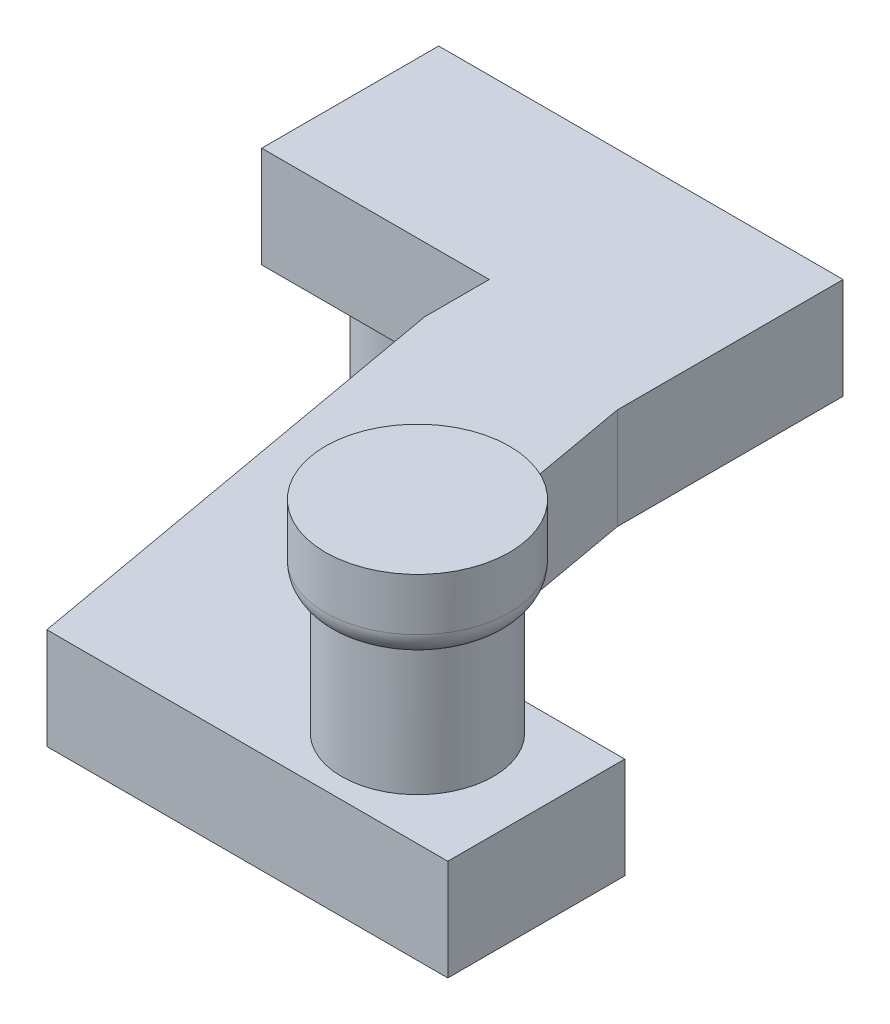
ISO-10303-21;
HEADER;
FILE_DESCRIPTION(('STEP AP214'),'2;1');
FILE_NAME('part.step','',(''),(''),'','','');
FILE_SCHEMA(('AUTOMOTIVE_DESIGN { 1 0 10303 214 1 1 1 1 }'));
ENDSEC;
DATA;
#1=APPLICATION_CONTEXT('core data for automotive mechanical design processes');
#2=APPLICATION_PROTOCOL_DEFINITION('international standard','automotive_design',2000,#1);
#3=PRODUCT_CONTEXT('',#1,'mechanical');
#4=PRODUCT('Part','Part','',(#3));
#5=PRODUCT_RELATED_PRODUCT_CATEGORY('part','',(#4));
#6=PRODUCT_DEFINITION_FORMATION('','',#4);
#7=PRODUCT_DEFINITION_CONTEXT('part definition',#1,'design');
#8=PRODUCT_DEFINITION('design','',#6,#7);
#9=PRODUCT_DEFINITION_SHAPE('','',#8);
#10=(LENGTH_UNIT() NAMED_UNIT(*) SI_UNIT(.MILLI.,.METRE.));
#11=(NAMED_UNIT(*) PLANE_ANGLE_UNIT() SI_UNIT($,.RADIAN.));
#12=(NAMED_UNIT(*) SI_UNIT($,.STERADIAN.) SOLID_ANGLE_UNIT());
#13=UNCERTAINTY_MEASURE_WITH_UNIT(LENGTH_MEASURE(1.E-05),#10,'distance_accuracy_value','');
#14=(GEOMETRIC_REPRESENTATION_CONTEXT(3) GLOBAL_UNCERTAINTY_ASSIGNED_CONTEXT((#13)) GLOBAL_UNIT_ASSIGNED_CONTEXT((#10,
#11,#12)) REPRESENTATION_CONTEXT('',''));
#15=CARTESIAN_POINT('',(0.,0.,0.));
#16=DIRECTION('',(0.,0.,1.));
#17=DIRECTION('',(1.,0.,0.));
#18=AXIS2_PLACEMENT_3D('',#15,#16,#17);
#19=CARTESIAN_POINT('',(0.,2.,0.));
#20=DIRECTION('',(1.,0.,0.));
#21=DIRECTION('',(0.,0.,-1.));
#22=AXIS2_PLACEMENT_3D('',#19,#20,#21);
#23=PLANE('',#22);
#24=DIRECTION('',(0.,0.,1.));
#25=VECTOR('',#24,1.);
#26=CARTESIAN_POINT('',(0.,0.,0.));
#27=LINE('',#26,#25);
#28=CARTESIAN_POINT('',(0.,0.,0.));
#29=VERTEX_POINT('',#28);
#30=CARTESIAN_POINT('',(0.,0.,3.5));
#31=VERTEX_POINT('',#30);
#32=EDGE_CURVE('E148',#29,#31,#27,.T.);
#33=ORIENTED_EDGE('',*,*,#32,.T.);
#34=DIRECTION('',(0.,-1.,0.));
#35=VECTOR('',#34,1.);
#36=CARTESIAN_POINT('',(0.,2.,3.5));
#37=LINE('',#36,#35);
#38=CARTESIAN_POINT('',(0.,2.,3.5));
#39=VERTEX_POINT('',#38);
#40=EDGE_CURVE('E186',#39,#31,#37,.T.);
#41=ORIENTED_EDGE('',*,*,#40,.F.);
#42=DIRECTION('',(0.,0.,1.));
#43=VECTOR('',#42,1.);
#44=CARTESIAN_POINT('',(0.,2.,0.));
#45=LINE('',#44,#43);
#46=CARTESIAN_POINT('',(0.,2.,0.));
#47=VERTEX_POINT('',#46);
#48=EDGE_CURVE('E167',#47,#39,#45,.T.);
#49=ORIENTED_EDGE('',*,*,#48,.F.);
#50=DIRECTION('',(0.,-1.,0.));
#51=VECTOR('',#50,1.);
#52=CARTESIAN_POINT('',(0.,2.,0.));
#53=LINE('',#52,#51);
#54=EDGE_CURVE('E144',#47,#29,#53,.T.);
#55=ORIENTED_EDGE('',*,*,#54,.T.);
#56=EDGE_LOOP('',(#33,#41,#49,#55));
#57=FACE_BOUND('',#56,.T.);
#58=ADVANCED_FACE('F33',(#57),#23,.F.);
#59=CARTESIAN_POINT('',(0.,2.,3.5));
#60=DIRECTION('',(0.,0.,-1.));
#61=DIRECTION('',(-1.,0.,0.));
#62=AXIS2_PLACEMENT_3D('',#59,#60,#61);
#63=PLANE('',#62);
#64=DIRECTION('',(1.,0.,0.));
#65=VECTOR('',#64,1.);
#66=CARTESIAN_POINT('',(0.,0.,3.5));
#67=LINE('',#66,#65);
#68=CARTESIAN_POINT('',(4.5,0.,3.5));
#69=VERTEX_POINT('',#68);
#70=EDGE_CURVE('E151',#31,#69,#67,.T.);
#71=ORIENTED_EDGE('',*,*,#70,.T.);
#72=DIRECTION('',(0.,-1.,0.));
#73=VECTOR('',#72,1.);
#74=CARTESIAN_POINT('',(4.5,2.,3.5));
#75=LINE('',#74,#73);
#76=CARTESIAN_POINT('',(4.5,2.,3.5));
#77=VERTEX_POINT('',#76);
#78=EDGE_CURVE('E183',#77,#69,#75,.T.);
#79=ORIENTED_EDGE('',*,*,#78,.F.);
#80=DIRECTION('',(1.,0.,0.));
#81=VECTOR('',#80,1.);
#82=CARTESIAN_POINT('',(0.,2.,3.5));
#83=LINE('',#82,#81);
#84=EDGE_CURVE('E105',#39,#77,#83,.T.);
#85=ORIENTED_EDGE('',*,*,#84,.F.);
#86=ORIENTED_EDGE('',*,*,#40,.T.);
#87=EDGE_LOOP('',(#71,#79,#85,#86));
#88=FACE_BOUND('',#87,.T.);
#89=ADVANCED_FACE('F267',(#88),#63,.F.);
#90=CARTESIAN_POINT('',(4.5,2.,3.5));
#91=DIRECTION('',(1.,0.,0.));
#92=DIRECTION('',(0.,0.,-1.));
#93=AXIS2_PLACEMENT_3D('',#90,#91,#92);
#94=PLANE('',#93);
#95=DIRECTION('',(0.,0.,1.));
#96=VECTOR('',#95,1.);
#97=CARTESIAN_POINT('',(4.5,0.,3.5));
#98=LINE('',#97,#96);
#99=CARTESIAN_POINT('',(4.5,0.,4.77729226627317));
#100=VERTEX_POINT('',#99);
#101=EDGE_CURVE('E154',#69,#100,#98,.T.);
#102=ORIENTED_EDGE('',*,*,#101,.T.);
#103=DIRECTION('',(0.,-1.,0.));
#104=VECTOR('',#103,1.);
#105=CARTESIAN_POINT('',(4.5,2.,4.77729226627317));
#106=LINE('',#105,#104);
#107=CARTESIAN_POINT('',(4.5,2.,4.77729226627317));
#108=VERTEX_POINT('',#107);
#109=EDGE_CURVE('E180',#108,#100,#106,.T.);
#110=ORIENTED_EDGE('',*,*,#109,.F.);
#111=DIRECTION('',(0.,0.,1.));
#112=VECTOR('',#111,1.);
#113=CARTESIAN_POINT('',(4.5,2.,3.5));
#114=LINE('',#113,#112);
#115=EDGE_CURVE('E282',#77,#108,#114,.T.);
#116=ORIENTED_EDGE('',*,*,#115,.F.);
#117=ORIENTED_EDGE('',*,*,#78,.T.);
#118=EDGE_LOOP('',(#102,#110,#116,#117));
#119=FACE_BOUND('',#118,.T.);
#120=ADVANCED_FACE('F263',(#119),#94,.F.);
#121=CARTESIAN_POINT('',(4.5,2.,4.77729226627317));
#122=DIRECTION('',(0.984430600055863,0.,-0.17577370017626));
#123=DIRECTION('',(-0.17577370017626,0.,-0.984430600055863));
#124=AXIS2_PLACEMENT_3D('',#121,#122,#123);
#125=PLANE('',#124);
#126=DIRECTION('',(0.17577370017626,0.,0.984430600055863));
#127=VECTOR('',#126,1.);
#128=CARTESIAN_POINT('',(4.5,0.,4.77729226627317));
#129=LINE('',#128,#127);
#130=CARTESIAN_POINT('',(6.12422531923838,0.,13.8738584991078));
#131=VERTEX_POINT('',#130);
#132=EDGE_CURVE('E156',#100,#131,#129,.T.);
#133=ORIENTED_EDGE('',*,*,#132,.T.);
#134=DIRECTION('',(0.,-1.,0.));
#135=VECTOR('',#134,1.);
#136=CARTESIAN_POINT('',(6.12422531923838,2.,13.8738584991078));
#137=LINE('',#136,#135);
#138=CARTESIAN_POINT('',(6.12422531923838,2.,13.8738584991078));
#139=VERTEX_POINT('',#138);
#140=EDGE_CURVE('E177',#139,#131,#137,.T.);
#141=ORIENTED_EDGE('',*,*,#140,.F.);
#142=DIRECTION('',(0.17577370017626,0.,0.984430600055863));
#143=VECTOR('',#142,1.);
#144=CARTESIAN_POINT('',(4.5,2.,4.77729226627317));
#145=LINE('',#144,#143);
#146=EDGE_CURVE('E284',#108,#139,#145,.T.);
#147=ORIENTED_EDGE('',*,*,#146,.F.);
#148=ORIENTED_EDGE('',*,*,#109,.T.);
#149=EDGE_LOOP('',(#133,#141,#147,#148));
#150=FACE_BOUND('',#149,.T.);
#151=ADVANCED_FACE('F259',(#150),#125,.F.);
#152=CARTESIAN_POINT('',(6.12422531923838,2.,13.8738584991078));
#153=DIRECTION('',(0.,0.,-1.));
#154=DIRECTION('',(-1.,0.,0.));
#155=AXIS2_PLACEMENT_3D('',#152,#153,#154);
#156=PLANE('',#155);
#157=DIRECTION('',(1.,0.,0.));
#158=VECTOR('',#157,1.);
#159=CARTESIAN_POINT('',(6.12422531923838,0.,13.8738584991078));
#160=LINE('',#159,#158);
#161=CARTESIAN_POINT('',(14.0546422010576,0.,13.8738584991078));
#162=VERTEX_POINT('',#161);
#163=EDGE_CURVE('E158',#131,#162,#160,.T.);
#164=ORIENTED_EDGE('',*,*,#163,.T.);
#165=DIRECTION('',(0.,-1.,0.));
#166=VECTOR('',#165,1.);
#167=CARTESIAN_POINT('',(14.0546422010576,2.,13.8738584991078));
#168=LINE('',#167,#166);
#169=CARTESIAN_POINT('',(14.0546422010576,2.,13.8738584991078));
#170=VERTEX_POINT('',#169);
#171=EDGE_CURVE('E174',#170,#162,#168,.T.);
#172=ORIENTED_EDGE('',*,*,#171,.F.);
#173=DIRECTION('',(1.,0.,0.));
#174=VECTOR('',#173,1.);
#175=CARTESIAN_POINT('',(6.12422531923838,2.,13.8738584991078));
#176=LINE('',#175,#174);
#177=EDGE_CURVE('E286',#139,#170,#176,.T.);
#178=ORIENTED_EDGE('',*,*,#177,.F.);
#179=ORIENTED_EDGE('',*,*,#140,.T.);
#180=EDGE_LOOP('',(#164,#172,#178,#179));
#181=FACE_BOUND('',#180,.T.);
#182=ADVANCED_FACE('F255',(#181),#156,.F.);
#183=CARTESIAN_POINT('',(14.0546422010576,2.,10.3738584991078));
#184=DIRECTION('',(-1.,0.,0.));
#185=DIRECTION('',(0.,0.,1.));
#186=AXIS2_PLACEMENT_3D('',#183,#184,#185);
#187=PLANE('',#186);
#188=DIRECTION('',(0.,0.,-1.));
#189=VECTOR('',#188,1.);
#190=CARTESIAN_POINT('',(14.0546422010576,0.,10.3738584991078));
#191=LINE('',#190,#189);
#192=CARTESIAN_POINT('',(14.0546422010576,0.,10.3738584991078));
#193=VERTEX_POINT('',#192);
#194=EDGE_CURVE('E160',#162,#193,#191,.T.);
#195=ORIENTED_EDGE('',*,*,#194,.T.);
#196=DIRECTION('',(0.,-1.,0.));
#197=VECTOR('',#196,1.);
#198=CARTESIAN_POINT('',(14.0546422010576,2.,10.3738584991078));
#199=LINE('',#198,#197);
#200=CARTESIAN_POINT('',(14.0546422010576,2.,10.3738584991078));
#201=VERTEX_POINT('',#200);
#202=EDGE_CURVE('E171',#201,#193,#199,.T.);
#203=ORIENTED_EDGE('',*,*,#202,.F.);
#204=DIRECTION('',(0.,0.,-1.));
#205=VECTOR('',#204,1.);
#206=CARTESIAN_POINT('',(14.0546422010576,2.,10.3738584991078));
#207=LINE('',#206,#205);
#208=EDGE_CURVE('E292',#170,#201,#207,.T.);
#209=ORIENTED_EDGE('',*,*,#208,.F.);
#210=ORIENTED_EDGE('',*,*,#171,.T.);
#211=EDGE_LOOP('',(#195,#203,#209,#210));
#212=FACE_BOUND('',#211,.T.);
#213=ADVANCED_FACE('F251',(#212),#187,.F.);
#214=CARTESIAN_POINT('',(9.05464220105756,2.,10.3738584991078));
#215=DIRECTION('',(0.,0.,1.));
#216=DIRECTION('',(1.,0.,0.));
#217=AXIS2_PLACEMENT_3D('',#214,#215,#216);
#218=PLANE('',#217);
#219=DIRECTION('',(-1.,0.,0.));
#220=VECTOR('',#219,1.);
#221=CARTESIAN_POINT('',(9.05464220105756,0.,10.3738584991078));
#222=LINE('',#221,#220);
#223=CARTESIAN_POINT('',(9.05464220105756,0.,10.3738584991078));
#224=VERTEX_POINT('',#223);
#225=EDGE_CURVE('E162',#193,#224,#222,.T.);
#226=ORIENTED_EDGE('',*,*,#225,.T.);
#227=DIRECTION('',(0.,-1.,0.));
#228=VECTOR('',#227,1.);
#229=CARTESIAN_POINT('',(9.05464220105756,2.,10.3738584991078));
#230=LINE('',#229,#228);
#231=CARTESIAN_POINT('',(9.05464220105756,2.,10.3738584991078));
#232=VERTEX_POINT('',#231);
#233=EDGE_CURVE('E139',#232,#224,#230,.T.);
#234=ORIENTED_EDGE('',*,*,#233,.F.);
#235=DIRECTION('',(-1.,0.,0.));
#236=VECTOR('',#235,1.);
#237=CARTESIAN_POINT('',(9.05464220105756,2.,10.3738584991078));
#238=LINE('',#237,#236);
#239=EDGE_CURVE('E130',#201,#232,#238,.T.);
#240=ORIENTED_EDGE('',*,*,#239,.F.);
#241=ORIENTED_EDGE('',*,*,#202,.T.);
#242=EDGE_LOOP('',(#226,#234,#240,#241));
#243=FACE_BOUND('',#242,.T.);
#244=ADVANCED_FACE('F248',(#243),#218,.F.);
#245=CARTESIAN_POINT('',(8.,2.,4.46727489877259));
#246=DIRECTION('',(-0.984430600055863,0.,0.17577370017626));
#247=DIRECTION('',(0.17577370017626,0.,0.984430600055863));
#248=AXIS2_PLACEMENT_3D('',#245,#246,#247);
#249=PLANE('',#248);
#250=DIRECTION('',(-0.17577370017626,0.,-0.984430600055863));
#251=VECTOR('',#250,1.);
#252=CARTESIAN_POINT('',(8.,0.,4.46727489877259));
#253=LINE('',#252,#251);
#254=CARTESIAN_POINT('',(8.,0.,4.46727489877259));
#255=VERTEX_POINT('',#254);
#256=EDGE_CURVE('E138',#224,#255,#253,.T.);
#257=ORIENTED_EDGE('',*,*,#256,.T.);
#258=DIRECTION('',(0.,-1.,0.));
#259=VECTOR('',#258,1.);
#260=CARTESIAN_POINT('',(8.,2.,4.46727489877259));
#261=LINE('',#260,#259);
#262=CARTESIAN_POINT('',(8.,2.,4.46727489877259));
#263=VERTEX_POINT('',#262);
#264=EDGE_CURVE('E135',#263,#255,#261,.T.);
#265=ORIENTED_EDGE('',*,*,#264,.F.);
#266=DIRECTION('',(-0.17577370017626,0.,-0.984430600055863));
#267=VECTOR('',#266,1.);
#268=CARTESIAN_POINT('',(8.,2.,4.46727489877259));
#269=LINE('',#268,#267);
#270=EDGE_CURVE('E124',#232,#263,#269,.T.);
#271=ORIENTED_EDGE('',*,*,#270,.F.);
#272=ORIENTED_EDGE('',*,*,#233,.T.);
#273=EDGE_LOOP('',(#257,#265,#271,#272));
#274=FACE_BOUND('',#273,.T.);
#275=ADVANCED_FACE('F136',(#274),#249,.F.);
#276=CARTESIAN_POINT('',(8.,2.,0.));
#277=DIRECTION('',(-1.,0.,0.));
#278=DIRECTION('',(0.,0.,1.));
#279=AXIS2_PLACEMENT_3D('',#276,#277,#278);
#280=PLANE('',#279);
#281=DIRECTION('',(0.,0.,-1.));
#282=VECTOR('',#281,1.);
#283=CARTESIAN_POINT('',(8.,0.,0.));
#284=LINE('',#283,#282);
#285=CARTESIAN_POINT('',(8.,0.,0.));
#286=VERTEX_POINT('',#285);
#287=EDGE_CURVE('E90',#255,#286,#284,.T.);
#288=ORIENTED_EDGE('',*,*,#287,.T.);
#289=DIRECTION('',(0.,-1.,0.));
#290=VECTOR('',#289,1.);
#291=CARTESIAN_POINT('',(8.,2.,0.));
#292=LINE('',#291,#290);
#293=CARTESIAN_POINT('',(8.,2.,0.));
#294=VERTEX_POINT('',#293);
#295=EDGE_CURVE('E140',#294,#286,#292,.T.);
#296=ORIENTED_EDGE('',*,*,#295,.F.);
#297=DIRECTION('',(0.,0.,-1.));
#298=VECTOR('',#297,1.);
#299=CARTESIAN_POINT('',(8.,2.,0.));
#300=LINE('',#299,#298);
#301=EDGE_CURVE('E128',#263,#294,#300,.T.);
#302=ORIENTED_EDGE('',*,*,#301,.F.);
#303=ORIENTED_EDGE('',*,*,#264,.T.);
#304=EDGE_LOOP('',(#288,#296,#302,#303));
#305=FACE_BOUND('',#304,.T.);
#306=ADVANCED_FACE('F142',(#305),#280,.F.);
#307=CARTESIAN_POINT('',(0.,2.,0.));
#308=DIRECTION('',(0.,0.,1.));
#309=DIRECTION('',(1.,0.,0.));
#310=AXIS2_PLACEMENT_3D('',#307,#308,#309);
#311=PLANE('',#310);
#312=DIRECTION('',(-1.,0.,0.));
#313=VECTOR('',#312,1.);
#314=CARTESIAN_POINT('',(0.,0.,0.));
#315=LINE('',#314,#313);
#316=EDGE_CURVE('E96',#286,#29,#315,.T.);
#317=ORIENTED_EDGE('',*,*,#316,.T.);
#318=ORIENTED_EDGE('',*,*,#54,.F.);
#319=DIRECTION('',(-1.,0.,0.));
#320=VECTOR('',#319,1.);
#321=CARTESIAN_POINT('',(0.,2.,0.));
#322=LINE('',#321,#320);
#323=EDGE_CURVE('E55',#294,#47,#322,.T.);
#324=ORIENTED_EDGE('',*,*,#323,.F.);
#325=ORIENTED_EDGE('',*,*,#295,.T.);
#326=EDGE_LOOP('',(#317,#318,#324,#325));
#327=FACE_BOUND('',#326,.T.);
#328=ADVANCED_FACE('F237',(#327),#311,.F.);
#329=CARTESIAN_POINT('',(0.,2.,0.));
#330=DIRECTION('',(0.,1.,0.));
#331=DIRECTION('',(0.,0.,1.));
#332=AXIS2_PLACEMENT_3D('',#329,#330,#331);
#333=PLANE('',#332);
#334=CARTESIAN_POINT('',(11.5546422010576,2.,11.9738584991078));
#335=DIRECTION('',(0.,1.,0.));
#336=DIRECTION('',(0.,0.,1.));
#337=AXIS2_PLACEMENT_3D('',#334,#335,#336);
#338=CIRCLE('',#337,1.5);
#339=CARTESIAN_POINT('',(11.5546422010576,2.,13.4738584991078));
#340=VERTEX_POINT('',#339);
#341=EDGE_CURVE('E302',#340,#340,#338,.T.);
#342=ORIENTED_EDGE('',*,*,#341,.F.);
#343=EDGE_LOOP('',(#342));
#344=FACE_BOUND('',#343,.T.);
#345=ORIENTED_EDGE('',*,*,#48,.T.);
#346=ORIENTED_EDGE('',*,*,#84,.T.);
#347=ORIENTED_EDGE('',*,*,#115,.T.);
#348=ORIENTED_EDGE('',*,*,#146,.T.);
#349=ORIENTED_EDGE('',*,*,#177,.T.);
#350=ORIENTED_EDGE('',*,*,#208,.T.);
#351=ORIENTED_EDGE('',*,*,#239,.T.);
#352=ORIENTED_EDGE('',*,*,#270,.T.);
#353=ORIENTED_EDGE('',*,*,#301,.T.);
#354=ORIENTED_EDGE('',*,*,#323,.T.);
#355=EDGE_LOOP('',(#345,#346,#347,#348,#349,#350,#351,#352,#353,#354));
#356=FACE_BOUND('',#355,.T.);
#357=ADVANCED_FACE('F126',(#344,#356),#333,.T.);
#358=CARTESIAN_POINT('',(0.,0.,0.));
#359=DIRECTION('',(0.,1.,0.));
#360=DIRECTION('',(0.,0.,1.));
#361=AXIS2_PLACEMENT_3D('',#358,#359,#360);
#362=PLANE('',#361);
#363=CARTESIAN_POINT('',(1.71799902517478,0.,1.49291010374952));
#364=DIRECTION('',(0.,1.,0.));
#365=DIRECTION('',(0.,0.,1.));
#366=AXIS2_PLACEMENT_3D('',#363,#364,#365);
#367=CIRCLE('',#366,1.4);
#368=CARTESIAN_POINT('',(1.71799902517478,0.,2.89291010374952));
#369=VERTEX_POINT('',#368);
#370=EDGE_CURVE('E46',#369,#369,#367,.F.);
#371=ORIENTED_EDGE('',*,*,#370,.F.);
#372=EDGE_LOOP('',(#371));
#373=FACE_BOUND('',#372,.T.);
#374=ORIENTED_EDGE('',*,*,#32,.F.);
#375=ORIENTED_EDGE('',*,*,#316,.F.);
#376=ORIENTED_EDGE('',*,*,#287,.F.);
#377=ORIENTED_EDGE('',*,*,#256,.F.);
#378=ORIENTED_EDGE('',*,*,#225,.F.);
#379=ORIENTED_EDGE('',*,*,#194,.F.);
#380=ORIENTED_EDGE('',*,*,#163,.F.);
#381=ORIENTED_EDGE('',*,*,#132,.F.);
#382=ORIENTED_EDGE('',*,*,#101,.F.);
#383=ORIENTED_EDGE('',*,*,#70,.F.);
#384=EDGE_LOOP('',(#374,#375,#376,#377,#378,#379,#380,#381,#382,#383));
#385=FACE_BOUND('',#384,.T.);
#386=ADVANCED_FACE('F233',(#373,#385),#362,.F.);
#387=CARTESIAN_POINT('',(11.5546422010576,4.5,11.9738584991078));
#388=DIRECTION('',(0.,-1.,0.));
#389=DIRECTION('',(0.,0.,-1.));
#390=AXIS2_PLACEMENT_3D('',#387,#388,#389);
#391=CYLINDRICAL_SURFACE('',#390,1.5);
#392=CARTESIAN_POINT('',(11.5546422010576,4.5,11.9738584991078));
#393=DIRECTION('',(0.,1.,0.));
#394=DIRECTION('',(0.,0.,1.));
#395=AXIS2_PLACEMENT_3D('',#392,#393,#394);
#396=CIRCLE('',#395,1.5);
#397=CARTESIAN_POINT('',(11.5546422010576,4.5,13.4738584991078));
#398=VERTEX_POINT('',#397);
#399=EDGE_CURVE('E152',#398,#398,#396,.T.);
#400=ORIENTED_EDGE('',*,*,#399,.F.);
#401=EDGE_LOOP('',(#400));
#402=FACE_BOUND('',#401,.T.);
#403=ORIENTED_EDGE('',*,*,#341,.T.);
#404=EDGE_LOOP('',(#403));
#405=FACE_BOUND('',#404,.T.);
#406=ADVANCED_FACE('F229',(#402,#405),#391,.T.);
#407=CARTESIAN_POINT('',(11.5546422010576,6.,11.9738584991078));
#408=DIRECTION('',(0.,-1.,0.));
#409=DIRECTION('',(0.,0.,-1.));
#410=AXIS2_PLACEMENT_3D('',#407,#408,#409);
#411=CYLINDRICAL_SURFACE('',#410,1.82);
#412=CARTESIAN_POINT('',(11.5546422010576,4.96647615158762,11.9738584991078));
#413=DIRECTION('',(0.,-1.,0.));
#414=DIRECTION('',(0.,0.,-1.));
#415=AXIS2_PLACEMENT_3D('',#412,#413,#414);
#416=CIRCLE('',#415,1.82);
#417=CARTESIAN_POINT('',(11.5546422010576,4.96647615158762,10.1538584991078));
#418=VERTEX_POINT('',#417);
#419=EDGE_CURVE('E188',#418,#418,#416,.F.);
#420=ORIENTED_EDGE('',*,*,#419,.T.);
#421=EDGE_LOOP('',(#420));
#422=FACE_BOUND('',#421,.T.);
#423=CARTESIAN_POINT('',(11.5546422010576,6.,11.9738584991078));
#424=DIRECTION('',(0.,1.,0.));
#425=DIRECTION('',(0.,0.,1.));
#426=AXIS2_PLACEMENT_3D('',#423,#424,#425);
#427=CIRCLE('',#426,1.82);
#428=CARTESIAN_POINT('',(11.5546422010576,6.,13.7938584991078));
#429=VERTEX_POINT('',#428);
#430=EDGE_CURVE('E305',#429,#429,#427,.T.);
#431=ORIENTED_EDGE('',*,*,#430,.F.);
#432=EDGE_LOOP('',(#431));
#433=FACE_BOUND('',#432,.T.);
#434=ADVANCED_FACE('F225',(#422,#433),#411,.T.);
#435=CARTESIAN_POINT('',(11.5546422010576,6.,11.9738584991078));
#436=DIRECTION('',(0.,1.,0.));
#437=DIRECTION('',(0.,0.,1.));
#438=AXIS2_PLACEMENT_3D('',#435,#436,#437);
#439=PLANE('',#438);
#440=ORIENTED_EDGE('',*,*,#430,.T.);
#441=EDGE_LOOP('',(#440));
#442=FACE_BOUND('',#441,.T.);
#443=ADVANCED_FACE('F222',(#442),#439,.T.);
#444=CARTESIAN_POINT('',(11.5546422010576,4.96647615158762,11.9738584991078));
#445=DIRECTION('',(0.,-1.,0.));
#446=DIRECTION('',(0.,0.,-1.));
#447=AXIS2_PLACEMENT_3D('',#444,#445,#446);
#448=TOROIDAL_SURFACE('',#447,1.32,0.5);
#449=ORIENTED_EDGE('',*,*,#399,.T.);
#450=EDGE_LOOP('',(#449));
#451=FACE_BOUND('',#450,.T.);
#452=ORIENTED_EDGE('',*,*,#419,.F.);
#453=EDGE_LOOP('',(#452));
#454=FACE_BOUND('',#453,.T.);
#455=ADVANCED_FACE('F205',(#451,#454),#448,.T.);
#456=CARTESIAN_POINT('',(1.71799902517478,-3.,1.49291010374952));
#457=DIRECTION('',(0.,1.,0.));
#458=DIRECTION('',(0.,0.,1.));
#459=AXIS2_PLACEMENT_3D('',#456,#457,#458);
#460=CYLINDRICAL_SURFACE('',#459,1.4);
#461=CARTESIAN_POINT('',(1.71799902517478,-3.,1.49291010374952));
#462=DIRECTION('',(0.,-1.,0.));
#463=DIRECTION('',(0.,0.,-1.));
#464=AXIS2_PLACEMENT_3D('',#461,#462,#463);
#465=CIRCLE('',#464,1.4);
#466=CARTESIAN_POINT('',(1.71799902517478,-3.,0.092910103749523));
#467=VERTEX_POINT('',#466);
#468=EDGE_CURVE('E310',#467,#467,#465,.T.);
#469=ORIENTED_EDGE('',*,*,#468,.F.);
#470=EDGE_LOOP('',(#469));
#471=FACE_BOUND('',#470,.T.);
#472=ORIENTED_EDGE('',*,*,#370,.T.);
#473=EDGE_LOOP('',(#472));
#474=FACE_BOUND('',#473,.T.);
#475=ADVANCED_FACE('F217',(#471,#474),#460,.T.);
#476=CARTESIAN_POINT('',(1.70707514817516,-4.,1.47636277256675));
#477=DIRECTION('',(0.,1.,0.));
#478=DIRECTION('',(0.,0.,1.));
#479=AXIS2_PLACEMENT_3D('',#476,#477,#478);
#480=CYLINDRICAL_SURFACE('',#479,1.7);
#481=CARTESIAN_POINT('',(1.56158385610216,-3.,0.101675294350339));
#482=CARTESIAN_POINT('',(1.52882992875689,-3.12442128304006,-0.21426718331242));
#483=CARTESIAN_POINT('',(1.52982743856105,-3.46555486195027,-0.214371756990318));
#484=CARTESIAN_POINT('',(1.63867384852243,-3.,0.0930081763675343));
#485=CARTESIAN_POINT('',(1.62374320981905,-3.12462079952637,-0.224274030546286));
#486=CARTESIAN_POINT('',(1.62489208327382,-3.46535648292519,-0.224337834054447));
#487=CARTESIAN_POINT('',(1.71653381245692,-3.,0.0907570756873619));
#488=CARTESIAN_POINT('',(1.71952912589098,-3.12485184709222,-0.226274116565132));
#489=CARTESIAN_POINT('',(1.72079913145256,-3.46512475632967,-0.226267016889922));
#490=CARTESIAN_POINT('',(1.87167627949557,-3.,0.0992034260340429));
#491=CARTESIAN_POINT('',(1.91011050503632,-3.12536834604793,-0.214165728947707));
#492=CARTESIAN_POINT('',(1.91157556383296,-3.46459883210575,-0.213996991704885));
#493=CARTESIAN_POINT('',(1.94895878253864,-3.,0.109900878430579));
#494=CARTESIAN_POINT('',(2.00488628950659,-3.12565368888358,-0.200074148669605));
#495=CARTESIAN_POINT('',(2.00644494792484,-3.46430463447075,-0.19979778197833));
#496=CARTESIAN_POINT('',(2.10082462573607,-3.,0.144021173134874));
#497=CARTESIAN_POINT('',(2.19075976646304,-3.12626829200513,-0.156169154022885));
#498=CARTESIAN_POINT('',(2.1924544649928,-3.46365947932288,-0.155673889507637));
#499=CARTESIAN_POINT('',(2.17540792642635,-3.,0.167444201418645));
#500=CARTESIAN_POINT('',(2.28184441522134,-3.12659744454652,-0.126377936422415));
#501=CARTESIAN_POINT('',(2.28359454344656,-3.46330852098056,-0.125748976942792));
#502=CARTESIAN_POINT('',(2.31979824003217,-3.,0.22645043485562));
#503=CARTESIAN_POINT('',(2.45774586322124,-3.1272879348633,-0.0519063984751976));
#504=CARTESIAN_POINT('',(2.45955689861788,-3.46255716154032,-0.0510231939622737));
#505=CARTESIAN_POINT('',(2.38960525305698,-3.,0.262033639730642));
#506=CARTESIAN_POINT('',(2.54255780100176,-3.12764917789205,-0.00725150939843121));
#507=CARTESIAN_POINT('',(2.54437917547996,-3.46215676044353,-0.00622232388691049));
#508=CARTESIAN_POINT('',(2.52246930069996,-3.,0.344459319136449));
#509=CARTESIAN_POINT('',(2.70350141262134,-3.12839149787393,0.0956923184159351));
#510=CARTESIAN_POINT('',(2.70529996982772,-3.4613155132579,0.0969845840271756));
#511=CARTESIAN_POINT('',(2.58552619440497,-3.,0.391302028650556));
#512=CARTESIAN_POINT('',(2.77963670122952,-3.12877250536539,0.15395596634541));
#513=CARTESIAN_POINT('',(2.78139830519774,-3.46087466632507,0.155390905807822));
#514=CARTESIAN_POINT('',(2.70306875787424,-3.,0.495021877598969));
#515=CARTESIAN_POINT('',(2.92105375177261,-3.1295419290379,0.282471870336724));
#516=CARTESIAN_POINT('',(2.92270915400359,-3.45996322159575,0.28415016692668));
#517=CARTESIAN_POINT('',(2.757554423112,-3.,0.551899022332462));
#518=CARTESIAN_POINT('',(2.98634750722367,-3.12993030783608,0.352701279055588));
#519=CARTESIAN_POINT('',(2.98792166169058,-3.45949262378355,0.354503112573905));
#520=CARTESIAN_POINT('',(2.8563457455663,-3.,0.674164848916684));
#521=CARTESIAN_POINT('',(3.10421664146435,-3.13070255893391,0.503162152490427));
#522=CARTESIAN_POINT('',(3.10561101913128,-3.45853397177206,0.505160073768637));
#523=CARTESIAN_POINT('',(2.90065119143116,-3.,0.739553707435081));
#524=CARTESIAN_POINT('',(3.15681059426996,-3.13108642953097,0.583376252669081));
#525=CARTESIAN_POINT('',(3.15808760447559,-3.45804591721059,0.585464295861465));
#526=CARTESIAN_POINT('',(2.97773264925382,-3.,0.877050793475659));
#527=CARTESIAN_POINT('',(3.24777133730828,-3.13183865758692,0.75152943708632));
#528=CARTESIAN_POINT('',(3.24881373448912,-3.457066049222,0.75374298258568));
#529=CARTESIAN_POINT('',(3.01050867238178,-3.,0.949159014487768));
#530=CARTESIAN_POINT('',(3.28616167867845,-3.13220704806277,0.839458177787715));
#531=CARTESIAN_POINT('',(3.28706329294204,-3.45657423579852,0.841717439785735));
#532=CARTESIAN_POINT('',(3.06349357840316,-3.,1.09808043544127));
#533=CARTESIAN_POINT('',(3.34761180977707,-3.13291859933335,1.02054220865303));
#534=CARTESIAN_POINT('',(3.34824998055393,-3.45560159540591,1.02284034499685));
#535=CARTESIAN_POINT('',(3.08370233166913,-3.,1.17489368390457));
#536=CARTESIAN_POINT('',(3.37069702178653,-3.13326182241806,1.11369560091392));
#537=CARTESIAN_POINT('',(3.37118695176855,-3.45512076855016,1.11598884636576));
#538=CARTESIAN_POINT('',(3.11086547962127,-3.,1.3310381261291));
#539=CARTESIAN_POINT('',(3.40086848811941,-3.13391477752624,1.30257592677495));
#540=CARTESIAN_POINT('',(3.40109665113483,-3.45418541261444,1.3048149983088));
#541=CARTESIAN_POINT('',(3.11781985047499,-3.,1.41036932441756));
#542=CARTESIAN_POINT('',(3.40797944952463,-3.13422459356887,1.39830949555047));
#543=CARTESIAN_POINT('',(3.40806935058144,-3.45373088358176,1.40049265343025));
#544=CARTESIAN_POINT('',(3.11817134046172,-3.,1.56925308757258));
#545=CARTESIAN_POINT('',(3.40599106570737,-3.13480402799692,1.58961964496832));
#546=CARTESIAN_POINT('',(3.40585233444415,-3.45286341039206,1.59166009989327));
#547=CARTESIAN_POINT('',(3.11156857458002,-3.,1.64880565055592));
#548=CARTESIAN_POINT('',(3.39691295971885,-3.13507374255838,1.68521067638908));
#549=CARTESIAN_POINT('',(3.39666275594121,-3.45245046588238,1.68714989282134));
#550=CARTESIAN_POINT('',(3.08490814883234,-3.,1.80579755105089));
#551=CARTESIAN_POINT('',(3.36279929682965,-3.13556776862012,1.87350846705408));
#552=CARTESIAN_POINT('',(3.36238205532043,-3.45168069395528,1.87523185388496));
#553=CARTESIAN_POINT('',(3.06485046346235,-3.,1.88323688455656));
#554=CARTESIAN_POINT('',(3.33777879828073,-3.13579217737383,1.96623584807703));
#555=CARTESIAN_POINT('',(3.3372909030609,-3.45132386664425,1.96782401652766));
#556=CARTESIAN_POINT('',(3.01179505273067,-3.,2.03370144710087));
#557=CARTESIAN_POINT('',(3.27249098993121,-3.13619175640266,2.14615743185095));
#558=CARTESIAN_POINT('',(3.27191933678832,-3.45067940419252,2.14748140003345));
#559=CARTESIAN_POINT('',(2.97879739689974,-3.,2.10672669985539));
#560=CARTESIAN_POINT('',(3.2322311356815,-3.13636701607439,2.23337612853644));
#561=CARTESIAN_POINT('',(3.23163900439182,-3.45039176868005,2.23454665059155));
#562=CARTESIAN_POINT('',(2.90078295471445,-3.,2.24617270687635));
#563=CARTESIAN_POINT('',(3.13761479184316,-3.13666563619121,2.39978645502925));
#564=CARTESIAN_POINT('',(3.1370340362578,-3.44989656612325,2.40067565633497));
#565=CARTESIAN_POINT('',(2.85576664242898,-3.,2.31259372150132));
#566=CARTESIAN_POINT('',(3.08325768720586,-3.13678907129505,2.47900392643288));
#567=CARTESIAN_POINT('',(3.08270995447046,-3.44968899592157,2.47973972695257));
#568=CARTESIAN_POINT('',(2.75501578716583,-3.,2.4368344083518));
#569=CARTESIAN_POINT('',(2.96200073312847,-3.13698238118465,2.62715430592045));
#570=CARTESIAN_POINT('',(2.96155969339827,-3.44936193450442,2.62762550888721));
#571=CARTESIAN_POINT('',(2.69928126148095,-3.,2.49465409445446));
#572=CARTESIAN_POINT('',(2.89509132167879,-3.1370523057752,2.6961109293976));
#573=CARTESIAN_POINT('',(2.89473353428433,-3.44924244314684,2.69644723672896));
#574=CARTESIAN_POINT('',(2.57873497802618,-3.,2.59994988357608));
#575=CARTESIAN_POINT('',(2.75064180125314,-3.13713772680935,2.82177319692002));
#576=CARTESIAN_POINT('',(2.75047425254211,-3.44909624057684,2.82189372663297));
#577=CARTESIAN_POINT('',(2.51392339771998,-3.,2.64742618877004));
#578=CARTESIAN_POINT('',(2.67308499465462,-3.13715324696198,2.87849826577421));
#579=CARTESIAN_POINT('',(2.67304133728505,-3.44906952755079,2.8785187270961));
#580=CARTESIAN_POINT('',(2.37712262628239,-3.,2.73063886406803));
#581=CARTESIAN_POINT('',(2.50952170046301,-3.13712971308261,2.97811467556069));
#582=CARTESIAN_POINT('',(2.50972960467634,-3.44910991094769,2.97799417595097));
#583=CARTESIAN_POINT('',(2.30512921851035,-3.,2.76636828375621));
#584=CARTESIAN_POINT('',(2.42348791611989,-3.13709062052565,3.02101033475882));
#585=CARTESIAN_POINT('',(2.42384582600707,-3.4491770627858,3.02083646904759));
#586=CARTESIAN_POINT('',(2.15620466701405,-3.,2.82496270880292));
#587=CARTESIAN_POINT('',(2.24553200384315,-3.13695832400912,3.09166827034704));
#588=CARTESIAN_POINT('',(2.2461723990251,-3.44940261326445,3.09144533964768));
#589=CARTESIAN_POINT('',(2.07927956724849,-3.,2.84784313752598));
#590=CARTESIAN_POINT('',(2.15359185304688,-3.13686515046472,3.11945309442513));
#591=CARTESIAN_POINT('',(2.15438997937408,-3.44956090204376,3.11922999027684));
#592=CARTESIAN_POINT('',(1.95219602738825,-3.,2.87408670722064));
#593=CARTESIAN_POINT('',(2.00162841297741,-3.13667108634689,3.15171952256612));
#594=CARTESIAN_POINT('',(2.00263739284942,-3.44988676482102,3.15153802869575));
#595=CARTESIAN_POINT('',(1.90282147678471,-3.,2.88155155957335));
#596=CARTESIAN_POINT('',(1.94255176722527,-3.13658617000466,3.16103384998304));
#597=CARTESIAN_POINT('',(1.94364907679695,-3.45002858179918,3.16087747031741));
#598=CARTESIAN_POINT('',(1.80360011562086,-3.,2.89117932247231));
#599=CARTESIAN_POINT('',(1.82375794321727,-3.13639627133593,3.17340564511245));
#600=CARTESIAN_POINT('',(1.82501824837874,-3.45034307524829,3.17331486842398));
#601=CARTESIAN_POINT('',(1.75375330507772,-3.,2.89334223321142));
#602=CARTESIAN_POINT('',(1.76403500845599,-3.13629127114619,3.17646083610627));
#603=CARTESIAN_POINT('',(1.7653757360368,-3.45051575171811,3.17641282513591));
#604=CARTESIAN_POINT('',(1.62420963235685,-3.,2.89203486111174));
#605=CARTESIAN_POINT('',(1.60866661583347,-3.1359926832366,3.17620137499145));
#606=CARTESIAN_POINT('',(1.61021917789598,-3.45100194138198,3.17628124171751));
#607=CARTESIAN_POINT('',(1.54455892233549,-3.,2.88440290432352));
#608=CARTESIAN_POINT('',(1.51300464662541,-3.13578376551825,3.16794946449326));
#609=CARTESIAN_POINT('',(1.51466701584838,-3.45133776797359,3.16813614259194));
#610=CARTESIAN_POINT('',(1.3878008412531,-3.,2.85574998145728));
#611=CARTESIAN_POINT('',(1.32438529787965,-3.13531918560969,3.13550128116705));
#612=CARTESIAN_POINT('',(1.32620764179061,-3.45207020241286,3.13591079551254));
#613=CARTESIAN_POINT('',(1.31069664960337,-3.,2.83471289743163));
#614=CARTESIAN_POINT('',(1.23141613952722,-3.13506337202139,3.11126537742096));
#615=CARTESIAN_POINT('',(1.23330375467292,-3.4524668829931,3.11181136315769));
#616=CARTESIAN_POINT('',(1.16137951427893,-3.,2.77995774369456));
#617=CARTESIAN_POINT('',(1.05095085371165,-3.13451002151595,3.04756094763494));
#618=CARTESIAN_POINT('',(1.05290992627128,-3.4533064198833,3.04836784492939));
#619=CARTESIAN_POINT('',(1.08916363286349,-3.,2.74624737157666));
#620=CARTESIAN_POINT('',(0.963443670319565,-3.13421241229748,3.00807725243245));
#621=CARTESIAN_POINT('',(0.965416736088214,-3.45374924804604,3.00903301240555));
#622=CARTESIAN_POINT('',(0.951641910608838,-3.,2.66721322708537));
#623=CARTESIAN_POINT('',(0.796327031809399,-3.13358156529981,2.91500974018581));
#624=CARTESIAN_POINT('',(0.798276969204067,-3.45466613793824,2.91623236275449));
#625=CARTESIAN_POINT('',(0.886336205088625,-3.,2.62188922734676));
#626=CARTESIAN_POINT('',(0.716718595126092,-3.13324823789333,2.86140006865529));
#627=CARTESIAN_POINT('',(0.718630546164952,-3.45514020027906,2.86276626897255));
#628=CARTESIAN_POINT('',(0.76446045118434,-3.,2.52102531804932));
#629=CARTESIAN_POINT('',(0.567645153347033,-3.13255367717294,2.74161424185872));
#630=CARTESIAN_POINT('',(0.569443946769291,-3.45610418679593,2.74322173549871));
#631=CARTESIAN_POINT('',(0.70789038143829,-3.,2.46548543347298));
#632=CARTESIAN_POINT('',(0.498189433411558,-3.13219237349815,2.67541423126652));
#633=CARTESIAN_POINT('',(0.499903745699183,-3.45659411093319,2.67714332664963));
#634=CARTESIAN_POINT('',(0.605028360869751,-3.,2.34585778177027));
#635=CARTESIAN_POINT('',(0.371375408944542,-3.13145105997029,2.53232954970832));
#636=CARTESIAN_POINT('',(0.372901594982618,-3.45757485424891,2.5342468275668));
#637=CARTESIAN_POINT('',(0.55873681473775,-3.,2.28176967823869));
#638=CARTESIAN_POINT('',(0.314034320162643,-3.13107100621555,2.45542497091529));
#639=CARTESIAN_POINT('',(0.315440120909779,-3.45806567346185,2.457428314663));
#640=CARTESIAN_POINT('',(0.477660187227286,-3.,2.14693472717402));
#641=CARTESIAN_POINT('',(0.213064545382229,-3.13030276053892,2.29311687949716));
#642=CARTESIAN_POINT('',(0.21423026050776,-3.45903411023283,2.29523490171096));
#643=CARTESIAN_POINT('',(0.442875017949352,-3.,2.0761879305133));
#644=CARTESIAN_POINT('',(0.169458042792907,-3.12991455886779,2.20770054533514));
#645=CARTESIAN_POINT('',(0.170481769422544,-3.4595117278917,2.20986006703263));
#646=CARTESIAN_POINT('',(0.385693079645957,-3.,1.93007778825964));
#647=CARTESIAN_POINT('',(0.0971797596613599,-3.12914161407236,2.03078774380926));
#648=CARTESIAN_POINT('',(0.0979394039824329,-3.46044098547928,2.03297721165478));
#649=CARTESIAN_POINT('',(0.363296285461133,-3.,1.8547144520427));
#650=CARTESIAN_POINT('',(0.0685332952454226,-3.12875689700454,1.93928647997983));
#651=CARTESIAN_POINT('',(0.0691454992565018,-3.46089262546074,1.94146920341145));
#652=CARTESIAN_POINT('',(0.33141726957808,-3.,1.70150852172686));
#653=CARTESIAN_POINT('',(0.0269762531697704,-3.12800317107212,1.75279139623125));
#654=CARTESIAN_POINT('',(0.0273298085114065,-3.46175870625624,1.75491800547442));
#655=CARTESIAN_POINT('',(0.321934980225374,-3.,1.62366594061801));
#656=CARTESIAN_POINT('',(0.0140911527520812,-3.12763422222936,1.65780142658356));
#657=CARTESIAN_POINT('',(0.0143079398682186,-3.46217314726515,1.65987483430286));
#658=CARTESIAN_POINT('',(0.316052033096812,-3.,1.46767315937105));
#659=CARTESIAN_POINT('',(0.00441473142218928,-3.12692441755981,1.46701173434305));
#660=CARTESIAN_POINT('',(0.0044059116757317,-3.46295528249873,1.46895110628926));
#661=CARTESIAN_POINT('',(0.319651350574333,-3.,1.38952295981513));
#662=CARTESIAN_POINT('',(0.00764627925796705,-3.12658364954088,1.37122408060501));
#663=CARTESIAN_POINT('',(0.00752572159104149,-3.46332297681184,1.37307055103166));
#664=CARTESIAN_POINT('',(0.339745887638794,-3.,1.23506611663463));
#665=CARTESIAN_POINT('',(0.0301085503775441,-3.12594217544955,1.1815448995958));
#666=CARTESIAN_POINT('',(0.0298184012117117,-3.464003762847,1.18319558092799));
#667=CARTESIAN_POINT('',(0.35624086719016,-3.,1.1587594387226));
#668=CARTESIAN_POINT('',(0.0493566325574213,-3.12564157404628,1.08767230134982));
#669=CARTESIAN_POINT('',(0.0489909721167784,-3.46431685558525,1.08920113100799));
#670=CARTESIAN_POINT('',(0.40160218756156,-3.,1.01006271519576));
#671=CARTESIAN_POINT('',(0.103307698127639,-3.12509136546112,0.904471448862695));
#672=CARTESIAN_POINT('',(0.102844725885111,-3.46488222597054,0.905764808899494));
#673=CARTESIAN_POINT('',(0.430468540022827,-3.,0.937672673266497));
#674=CARTESIAN_POINT('',(0.138021113810714,-3.12484186837739,0.815166948735657));
#675=CARTESIAN_POINT('',(0.137525923341709,-3.46513450356035,0.816322940994989));
#676=CARTESIAN_POINT('',(0.499729263671734,-3.,0.79876163553595));
#677=CARTESIAN_POINT('',(0.221923493165563,-3.12440322721321,0.643626694276506));
#678=CARTESIAN_POINT('',(0.221411609343222,-3.46557355351042,0.644532982241071));
#679=CARTESIAN_POINT('',(0.540123382026749,-3.,0.732240511056568));
#680=CARTESIAN_POINT('',(0.271114134252716,-3.12421418249018,0.561416653773846));
#681=CARTESIAN_POINT('',(0.270615779363978,-3.46576032730714,0.562184735862427));
#682=CARTESIAN_POINT('',(0.631305061995429,-3.,0.60684823743096));
#683=CARTESIAN_POINT('',(0.382585391019835,-3.12390368433915,0.406387248693561));
#684=CARTESIAN_POINT('',(0.382150978841272,-3.46606509219059,0.40691762044175));
#685=CARTESIAN_POINT('',(0.682092618377177,-3.,0.547977084433864));
#686=CARTESIAN_POINT('',(0.444859334805892,-3.12378230907812,0.333592964913265));
#687=CARTESIAN_POINT('',(0.444482001689929,-3.46618308331194,0.333998746653124));
#688=CARTESIAN_POINT('',(0.792663835095051,-3.,0.439460927718572));
#689=CARTESIAN_POINT('',(0.580741091256668,-3.12361188728583,0.19945693636459));
#690=CARTESIAN_POINT('',(0.580500398254999,-3.46634829160519,0.199661532145413));
#691=CARTESIAN_POINT('',(0.852447347918,-3.,0.389815772744871));
#692=CARTESIAN_POINT('',(0.654334135654884,-3.12356288492699,0.138136480512779));
#693=CARTESIAN_POINT('',(0.654187585756679,-3.46639550993745,0.138243002883951));
#694=CARTESIAN_POINT('',(0.979387774841372,-3.,0.301083673214618));
#695=CARTESIAN_POINT('',(0.810779438890601,-3.1235391565831,0.0286860026677068));
#696=CARTESIAN_POINT('',(0.810827296590556,-3.46641839796112,0.0286485310638449));
#697=CARTESIAN_POINT('',(1.04654468950044,-3.,0.261996729458012));
#698=CARTESIAN_POINT('',(0.893610835009727,-3.12356443705602,-0.0194285676110784));
#699=CARTESIAN_POINT('',(0.893779820624741,-3.4663940676471,-0.0195274104914718));
#700=CARTESIAN_POINT('',(1.18641936451496,-3.,0.195442730672285));
#701=CARTESIAN_POINT('',(1.06619406238743,-3.12368832603242,-0.101098208712536));
#702=CARTESIAN_POINT('',(1.06659477151665,-3.46627425852304,-0.101268835716726));
#703=CARTESIAN_POINT('',(1.25913708621424,-3.,0.167975594876293));
#704=CARTESIAN_POINT('',(1.15592104888657,-3.12378690070681,-0.134645695247229));
#705=CARTESIAN_POINT('',(1.15645715034028,-3.46617878020755,-0.13483442094026));
#706=CARTESIAN_POINT('',(1.40817450246046,-3.,0.125425417245146));
#707=CARTESIAN_POINT('',(1.33976036195077,-3.12405358181515,-0.186222603299344));
#708=CARTESIAN_POINT('',(1.34054136702692,-3.46591827100352,-0.186402864244892));
#709=CARTESIAN_POINT('',(1.48449419685188,-3.,0.110342374875316));
#710=CARTESIAN_POINT('',(1.43384674925897,-3.12422161962077,-0.204252966583361));
#711=CARTESIAN_POINT('',(1.43476320470171,-3.46575324011799,-0.2044057229979));
#712=CARTESIAN_POINT('',(1.56158385610216,-3.,0.101675294350339));
#713=CARTESIAN_POINT('',(1.52882992875689,-3.12442128304006,-0.21426718331242));
#714=CARTESIAN_POINT('',(1.52982743856105,-3.46555486195027,-0.214371756990318));
#715=(BOUNDED_SURFACE() B_SPLINE_SURFACE(3,2,((#481,#482,#483),(#484,#485,#486),(#487,#488,
#489),(#490,#491,#492),(#493,#494,#495),(#496,#497,#498),(#499,#500,#501),(#502,#503,#504),
(#505,#506,#507),(#508,#509,#510),(#511,#512,#513),(#514,#515,#516),(#517,#518,#519),(#520,#521,
#522),(#523,#524,#525),(#526,#527,#528),(#529,#530,#531),(#532,#533,#534),(#535,#536,#537),
(#538,#539,#540),(#541,#542,#543),(#544,#545,#546),(#547,#548,#549),(#550,#551,#552),(#553,#554,
#555),(#556,#557,#558),(#559,#560,#561),(#562,#563,#564),(#565,#566,#567),(#568,#569,#570),
(#571,#572,#573),(#574,#575,#576),(#577,#578,#579),(#580,#581,#582),(#583,#584,#585),(#586,#587,
#588),(#589,#590,#591),(#592,#593,#594),(#595,#596,#597),(#598,#599,#600),(#601,#602,#603),
(#604,#605,#606),(#607,#608,#609),(#610,#611,#612),(#613,#614,#615),(#616,#617,#618),(#619,#620,
#621),(#622,#623,#624),(#625,#626,#627),(#628,#629,#630),(#631,#632,#633),(#634,#635,#636),
(#637,#638,#639),(#640,#641,#642),(#643,#644,#645),(#646,#647,#648),(#649,#650,#651),(#652,#653,
#654),(#655,#656,#657),(#658,#659,#660),(#661,#662,#663),(#664,#665,#666),(#667,#668,#669),
(#670,#671,#672),(#673,#674,#675),(#676,#677,#678),(#679,#680,#681),(#682,#683,#684),(#685,#686,
#687),(#688,#689,#690),(#691,#692,#693),(#694,#695,#696),(#697,#698,#699),(#700,#701,#702),
(#703,#704,#705),(#706,#707,#708),(#709,#710,#711),(#712,#713,#714)),.UNSPECIFIED.,.T.,.F.,
.F.) B_SPLINE_SURFACE_WITH_KNOTS((4,2,2,2,2,2,2,2,2,2,2,2,2,2,2,2,2,2,2,2,2,2,2,2,2,2,2,2,2,2,2,
2,2,2,2,2,2,2,4),(3,3),(0.,0.202178481843463,0.404356985073136,0.606538443089578,
0.80871989648081,1.01090556971979,1.21309134973336,1.41528132694958,1.61747110827557,
1.81966297509116,2.02185520546384,2.2240457209439,2.42623661968045,2.62842643199308,
2.83060827022461,3.03278978225798,3.23496734203251,3.43726431215934,3.63931793198051,
3.76557666027762,3.89183538398214,4.09389705519016,4.29620213927935,4.49838454384573,
4.70057090693062,4.90275677558454,5.10495060337709,5.30714288653564,5.50933475906344,
5.71152557237616,5.91371600320244,6.11590267061274,6.31808952827738,6.52027195182125,
6.72245427358943,6.92463328038965,7.12681230250798,7.32898991929887,7.53116752736089),(0.,1.),
.UNSPECIFIED.) GEOMETRIC_REPRESENTATION_ITEM() RATIONAL_B_SPLINE_SURFACE(((1.,0.826053546568855,
1.),(1.,0.826359391912967,1.),(1.,0.826715062814188,1.),(1.,0.827516058739235,1.),(1.,
0.827961383772544,1.),(1.,0.828929171146576,1.),(1.,0.829451634614545,1.),(1.,0.830558990993702,
1.),(1.,0.831143883903463,1.),(1.,0.832359631531617,1.),(1.,0.832990487209052,1.),(1.,
0.834280349831142,1.),(1.,0.834939356790663,1.),(1.,0.836266902548349,1.),(1.,0.836935441544103,
1.),(1.,0.838263092159574,1.),(1.,0.838922203788424,1.),(1.,0.840212275035399,1.),(1.,
0.84084323436308,1.),(1.,0.842059010566757,1.),(1.,0.842643827359783,1.),(1.,0.843750586971305,
1.),(1.,0.844272530323025,1.),(1.,0.84523857659444,1.),(1.,0.845682679366585,1.),(1.,
0.846480260231502,1.),(1.,0.846833738811211,1.),(1.,0.847439862403542,1.),(1.,0.847692511392347,
1.),(1.,0.848089692859555,1.),(1.,0.848234225512391,1.),(1.,0.848410977282342,1.),(1.,
0.848443198594915,1.),(1.,0.848394425735665,1.),(1.,0.848313364685137,1.),(1.,0.848040271902212,
1.),(1.,0.847848373777741,1.),(1.,0.847451457917423,1.),(1.,0.847278364975554,1.),(1.,
0.846893227158586,1.),(1.,0.846681182284905,1.),(1.,0.846081804743155,1.),(1.,0.84566566550018,
1.),(1.,0.84475085507244,1.),(1.,0.844252085069752,1.),(1.,0.84318688120176,1.),(1.,
0.842620488551811,1.),(1.,0.841436038528239,1.),(1.,0.84081798014329,1.),(1.,0.839547834419775,
1.),(1.,0.838895747164428,1.),(1.,0.837576066920607,1.),(1.,0.836908473322755,1.),(1.,
0.835576745619699,1.),(1.,0.834912611488106,1.),(1.,0.833606590878189,1.),(1.,0.832964704354685,
1.),(1.,0.8317213041108,1.),(1.,0.831119790178937,1.),(1.,0.829974089264837,1.),(1.,
0.829429902174156,1.),(1.,0.828414184217116,1.),(1.,0.827942651998579,1.),(1.,0.827085496104332,
1.),(1.,0.826699872509461,1.),(1.,0.826025382541119,1.),(1.,0.825736514045871,1.),(1.,
0.82526364126684,1.),(1.,0.82507963693027,1.),(1.,0.82482166444624,1.),(1.,0.824747694494683,
1.),(1.,0.824711863240551,1.),(1.,0.82475000194647,1.),(1.,0.8249373158662,1.),(1.,
0.825086490308205,1.),(1.,0.82549168365069,1.),(1.,0.825747702546556,1.),(1.,0.826053546568855,1.))) REPRESENTATION_ITEM('') SURFACE());
#716=CARTESIAN_POINT('',(1.52982743856105,-3.46555486195027,-0.214371756990318));
#717=CARTESIAN_POINT('',(1.62489208327382,-3.46535648292519,-0.224337834054447));
#718=CARTESIAN_POINT('',(1.72079913145256,-3.46512475632967,-0.226267016889922));
#719=CARTESIAN_POINT('',(1.91157556383296,-3.46459883210575,-0.213996991704885));
#720=CARTESIAN_POINT('',(2.00644494792484,-3.46430463447075,-0.19979778197833));
#721=CARTESIAN_POINT('',(2.1924544649928,-3.46365947932288,-0.155673889507637));
#722=CARTESIAN_POINT('',(2.28359454344656,-3.46330852098056,-0.125748976942792));
#723=CARTESIAN_POINT('',(2.45955689861788,-3.46255716154032,-0.0510231939622737));
#724=CARTESIAN_POINT('',(2.54437917547996,-3.46215676044353,-0.0062223238869105));
#725=CARTESIAN_POINT('',(2.70529996982772,-3.4613155132579,0.0969845840271756));
#726=CARTESIAN_POINT('',(2.78139830519774,-3.46087466632507,0.155390905807822));
#727=CARTESIAN_POINT('',(2.92270915400359,-3.45996322159575,0.28415016692668));
#728=CARTESIAN_POINT('',(2.98792166169058,-3.45949262378355,0.354503112573905));
#729=CARTESIAN_POINT('',(3.10561101913127,-3.45853397177206,0.505160073768637));
#730=CARTESIAN_POINT('',(3.15808760447559,-3.45804591721059,0.585464295861465));
#731=CARTESIAN_POINT('',(3.24881373448912,-3.457066049222,0.75374298258568));
#732=CARTESIAN_POINT('',(3.28706329294204,-3.45657423579852,0.841717439785735));
#733=CARTESIAN_POINT('',(3.34824998055393,-3.45560159540592,1.02284034499685));
#734=CARTESIAN_POINT('',(3.37118695176855,-3.45512076855016,1.11598884636576));
#735=CARTESIAN_POINT('',(3.40109665113483,-3.45418541261444,1.3048149983088));
#736=CARTESIAN_POINT('',(3.40806935058144,-3.45373088358176,1.40049265343025));
#737=CARTESIAN_POINT('',(3.40585233444415,-3.45286341039206,1.59166009989327));
#738=CARTESIAN_POINT('',(3.39666275594121,-3.45245046588237,1.68714989282134));
#739=CARTESIAN_POINT('',(3.36238205532043,-3.45168069395528,1.87523185388496));
#740=CARTESIAN_POINT('',(3.3372909030609,-3.45132386664425,1.96782401652766));
#741=CARTESIAN_POINT('',(3.27191933678832,-3.45067940419252,2.14748140003345));
#742=CARTESIAN_POINT('',(3.23163900439182,-3.45039176868005,2.23454665059155));
#743=CARTESIAN_POINT('',(3.1370340362578,-3.44989656612325,2.40067565633497));
#744=CARTESIAN_POINT('',(3.08270995447046,-3.44968899592157,2.47973972695257));
#745=CARTESIAN_POINT('',(2.96155969339827,-3.44936193450442,2.62762550888721));
#746=CARTESIAN_POINT('',(2.89473353428433,-3.44924244314684,2.69644723672896));
#747=CARTESIAN_POINT('',(2.75047425254211,-3.44909624057684,2.82189372663297));
#748=CARTESIAN_POINT('',(2.67304133728505,-3.4490695275508,2.8785187270961));
#749=CARTESIAN_POINT('',(2.50972960467634,-3.44910991094769,2.97799417595097));
#750=CARTESIAN_POINT('',(2.42384582600707,-3.4491770627858,3.02083646904759));
#751=CARTESIAN_POINT('',(2.2461723990251,-3.44940261326445,3.09144533964768));
#752=CARTESIAN_POINT('',(2.15438997937408,-3.44956090204376,3.11922999027684));
#753=CARTESIAN_POINT('',(2.00263739284942,-3.44988676482102,3.15153802869575));
#754=CARTESIAN_POINT('',(1.94364907679695,-3.45002858179918,3.16087747031741));
#755=CARTESIAN_POINT('',(1.82501824837874,-3.45034307524829,3.17331486842398));
#756=CARTESIAN_POINT('',(1.7653757360368,-3.45051575171811,3.17641282513591));
#757=CARTESIAN_POINT('',(1.61021917789598,-3.45100194138198,3.17628124171751));
#758=CARTESIAN_POINT('',(1.51466701584838,-3.45133776797359,3.16813614259194));
#759=CARTESIAN_POINT('',(1.32620764179061,-3.45207020241286,3.13591079551254));
#760=CARTESIAN_POINT('',(1.23330375467292,-3.4524668829931,3.11181136315769));
#761=CARTESIAN_POINT('',(1.05290992627128,-3.4533064198833,3.04836784492939));
#762=CARTESIAN_POINT('',(0.965416736088214,-3.45374924804604,3.00903301240555));
#763=CARTESIAN_POINT('',(0.798276969204067,-3.45466613793824,2.91623236275449));
#764=CARTESIAN_POINT('',(0.718630546164952,-3.45514020027906,2.86276626897255));
#765=CARTESIAN_POINT('',(0.569443946769291,-3.45610418679593,2.74322173549871));
#766=CARTESIAN_POINT('',(0.499903745699183,-3.45659411093319,2.67714332664963));
#767=CARTESIAN_POINT('',(0.372901594982618,-3.45757485424891,2.5342468275668));
#768=CARTESIAN_POINT('',(0.315440120909779,-3.45806567346185,2.457428314663));
#769=CARTESIAN_POINT('',(0.21423026050776,-3.45903411023283,2.29523490171096));
#770=CARTESIAN_POINT('',(0.170481769422544,-3.4595117278917,2.20986006703263));
#771=CARTESIAN_POINT('',(0.0979394039824329,-3.46044098547928,2.03297721165478));
#772=CARTESIAN_POINT('',(0.0691454992565018,-3.46089262546074,1.94146920341145));
#773=CARTESIAN_POINT('',(0.0273298085114065,-3.46175870625624,1.75491800547442));
#774=CARTESIAN_POINT('',(0.0143079398682186,-3.46217314726515,1.65987483430286));
#775=CARTESIAN_POINT('',(0.00440591167573171,-3.46295528249873,1.46895110628926));
#776=CARTESIAN_POINT('',(0.00752572159104147,-3.46332297681184,1.37307055103166));
#777=CARTESIAN_POINT('',(0.0298184012117117,-3.464003762847,1.18319558092799));
#778=CARTESIAN_POINT('',(0.0489909721167784,-3.46431685558525,1.08920113100799));
#779=CARTESIAN_POINT('',(0.102844725885111,-3.46488222597054,0.905764808899494));
#780=CARTESIAN_POINT('',(0.137525923341709,-3.46513450356035,0.816322940994989));
#781=CARTESIAN_POINT('',(0.221411609343222,-3.46557355351042,0.644532982241071));
#782=CARTESIAN_POINT('',(0.270615779363977,-3.46576032730714,0.562184735862428));
#783=CARTESIAN_POINT('',(0.382150978841272,-3.46606509219059,0.40691762044175));
#784=CARTESIAN_POINT('',(0.444482001689929,-3.46618308331194,0.333998746653124));
#785=CARTESIAN_POINT('',(0.580500398254999,-3.46634829160519,0.199661532145413));
#786=CARTESIAN_POINT('',(0.65418758575668,-3.46639550993745,0.138243002883951));
#787=CARTESIAN_POINT('',(0.810827296590556,-3.46641839796112,0.028648531063845));
#788=CARTESIAN_POINT('',(0.89377982062474,-3.4663940676471,-0.0195274104914717));
#789=CARTESIAN_POINT('',(1.06659477151665,-3.46627425852304,-0.101268835716726));
#790=CARTESIAN_POINT('',(1.15645715034028,-3.46617878020755,-0.13483442094026));
#791=CARTESIAN_POINT('',(1.34054136702692,-3.46591827100352,-0.186402864244892));
#792=CARTESIAN_POINT('',(1.43476320470171,-3.46575324011799,-0.2044057229979));
#793=CARTESIAN_POINT('',(1.52982743856105,-3.46555486195027,-0.214371756990318));
#794=B_SPLINE_CURVE_WITH_KNOTS('',3,(#716,#717,#718,#719,#720,#721,#722,#723,#724,#725,#726,
#727,#728,#729,#730,#731,#732,#733,#734,#735,#736,#737,#738,#739,#740,#741,#742,#743,#744,#745,
#746,#747,#748,#749,#750,#751,#752,#753,#754,#755,#756,#757,#758,#759,#760,#761,#762,#763,#764,
#765,#766,#767,#768,#769,#770,#771,#772,#773,#774,#775,#776,#777,#778,#779,#780,#781,#782,#783,
#784,#785,#786,#787,#788,#789,#790,#791,#792,#793),.UNSPECIFIED.,.T.,.F.,(4,2,2,2,2,2,2,2,2,2,2,
2,2,2,2,2,2,2,2,2,2,2,2,2,2,2,2,2,2,2,2,2,2,2,2,2,2,2,4),(0.,0.202178481843463,
0.404356985073136,0.606538443089578,0.80871989648081,1.01090556971979,1.21309134973336,
1.41528132694958,1.61747110827557,1.81966297509116,2.02185520546384,2.2240457209439,
2.42623661968045,2.62842643199308,2.83060827022461,3.03278978225798,3.23496734203251,
3.43726431215934,3.63931793198051,3.76557666027762,3.89183538398214,4.09389705519016,
4.29620213927935,4.49838454384573,4.70057090693062,4.90275677558454,5.10495060337709,
5.30714288653564,5.50933475906344,5.71152557237616,5.91371600320244,6.11590267061274,
6.31808952827738,6.52027195182125,6.72245427358943,6.92463328038965,7.12681230250798,
7.32898991929887,7.53116752736089),.UNSPECIFIED.);
#795=CARTESIAN_POINT('',(1.52982743856105,-3.46555486195027,-0.214371756990318));
#796=VERTEX_POINT('',#795);
#797=EDGE_CURVE('E11',#796,#796,#794,.T.);
#798=ORIENTED_EDGE('',*,*,#797,.T.);
#799=EDGE_LOOP('',(#798));
#800=FACE_BOUND('',#799,.T.);
#801=CARTESIAN_POINT('',(1.70707514817516,-4.,1.47636277256675));
#802=DIRECTION('',(0.,-1.,0.));
#803=DIRECTION('',(0.,0.,-1.));
#804=AXIS2_PLACEMENT_3D('',#801,#802,#803);
#805=CIRCLE('',#804,1.7);
#806=CARTESIAN_POINT('',(1.70707514817516,-4.,-0.223637227433253));
#807=VERTEX_POINT('',#806);
#808=EDGE_CURVE('E313',#807,#807,#805,.T.);
#809=ORIENTED_EDGE('',*,*,#808,.F.);
#810=EDGE_LOOP('',(#809));
#811=FACE_BOUND('',#810,.T.);
#812=ADVANCED_FACE('F198',(#800,#811),#480,.T.);
#813=CARTESIAN_POINT('',(1.70707514817516,-4.,1.47636277256675));
#814=DIRECTION('',(0.,-1.,0.));
#815=DIRECTION('',(0.,0.,-1.));
#816=AXIS2_PLACEMENT_3D('',#813,#814,#815);
#817=PLANE('',#816);
#818=ORIENTED_EDGE('',*,*,#808,.T.);
#819=EDGE_LOOP('',(#818));
#820=FACE_BOUND('',#819,.T.);
#821=ADVANCED_FACE('F211',(#820),#817,.T.);
#822=ORIENTED_EDGE('',*,*,#468,.T.);
#823=EDGE_LOOP('',(#822));
#824=FACE_BOUND('',#823,.T.);
#825=ORIENTED_EDGE('',*,*,#797,.F.);
#826=EDGE_LOOP('',(#825));
#827=FACE_BOUND('',#826,.T.);
#828=ADVANCED_FACE('F207',(#824,#827),#715,.T.);
#829=CLOSED_SHELL('',(#58,#89,#120,#151,#182,#213,#244,#275,#306,#328,#357,#386,#406,#434,#443,
#455,#475,#812,#821,#828));
#830=MANIFOLD_SOLID_BREP('B2',#829);
#831=ADVANCED_BREP_SHAPE_REPRESENTATION('',(#18,#830),#14);
#832=SHAPE_DEFINITION_REPRESENTATION(#9,#831);
ENDSEC;
END-ISO-10303-21;
